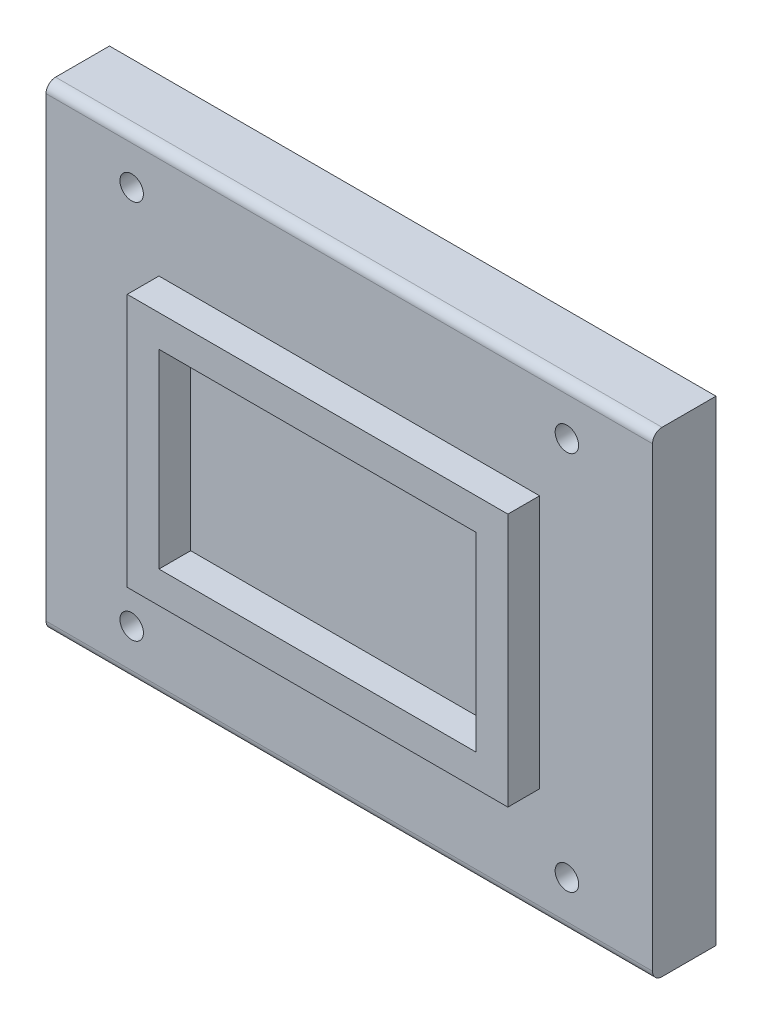
ISO-10303-21;
HEADER;
FILE_DESCRIPTION(('STEP AP214'),'2;1');
FILE_NAME('part.step','',(''),(''),'','','');
FILE_SCHEMA(('AUTOMOTIVE_DESIGN { 1 0 10303 214 1 1 1 1 }'));
ENDSEC;
DATA;
#1=APPLICATION_CONTEXT('core data for automotive mechanical design processes');
#2=APPLICATION_PROTOCOL_DEFINITION('international standard','automotive_design',2000,#1);
#3=PRODUCT_CONTEXT('',#1,'mechanical');
#4=PRODUCT('Part','Part','',(#3));
#5=PRODUCT_RELATED_PRODUCT_CATEGORY('part','',(#4));
#6=PRODUCT_DEFINITION_FORMATION('','',#4);
#7=PRODUCT_DEFINITION_CONTEXT('part definition',#1,'design');
#8=PRODUCT_DEFINITION('design','',#6,#7);
#9=PRODUCT_DEFINITION_SHAPE('','',#8);
#10=(LENGTH_UNIT() NAMED_UNIT(*) SI_UNIT(.MILLI.,.METRE.));
#11=(NAMED_UNIT(*) PLANE_ANGLE_UNIT() SI_UNIT($,.RADIAN.));
#12=(NAMED_UNIT(*) SI_UNIT($,.STERADIAN.) SOLID_ANGLE_UNIT());
#13=UNCERTAINTY_MEASURE_WITH_UNIT(LENGTH_MEASURE(1.E-05),#10,'distance_accuracy_value','');
#14=(GEOMETRIC_REPRESENTATION_CONTEXT(3) GLOBAL_UNCERTAINTY_ASSIGNED_CONTEXT((#13)) GLOBAL_UNIT_ASSIGNED_CONTEXT((#10,
#11,#12)) REPRESENTATION_CONTEXT('',''));
#15=CARTESIAN_POINT('',(0.,0.,0.));
#16=DIRECTION('',(0.,0.,1.));
#17=DIRECTION('',(1.,0.,0.));
#18=AXIS2_PLACEMENT_3D('',#15,#16,#17);
#19=CARTESIAN_POINT('',(0.,0.,10.));
#20=DIRECTION('',(0.,0.,1.));
#21=DIRECTION('',(1.,0.,0.));
#22=AXIS2_PLACEMENT_3D('',#19,#20,#21);
#23=PLANE('',#22);
#24=CARTESIAN_POINT('',(42.6478100784572,-49.8231019522776,10.));
#25=DIRECTION('',(0.,0.,1.));
#26=DIRECTION('',(1.,0.,0.));
#27=AXIS2_PLACEMENT_3D('',#24,#25,#26);
#28=CIRCLE('',#27,1.85);
#29=CARTESIAN_POINT('',(44.4978100784572,-49.8231019522776,10.));
#30=VERTEX_POINT('',#29);
#31=EDGE_CURVE('E232',#30,#30,#28,.T.);
#32=ORIENTED_EDGE('',*,*,#31,.F.);
#33=EDGE_LOOP('',(#32));
#34=FACE_BOUND('',#33,.T.);
#35=CARTESIAN_POINT('',(42.6478100784572,10.0768980477223,10.));
#36=DIRECTION('',(0.,0.,1.));
#37=DIRECTION('',(1.,0.,0.));
#38=AXIS2_PLACEMENT_3D('',#35,#36,#37);
#39=CIRCLE('',#38,1.85);
#40=CARTESIAN_POINT('',(44.4978100784572,10.0768980477223,10.));
#41=VERTEX_POINT('',#40);
#42=EDGE_CURVE('E248',#41,#41,#39,.T.);
#43=ORIENTED_EDGE('',*,*,#42,.F.);
#44=EDGE_LOOP('',(#43));
#45=FACE_BOUND('',#44,.T.);
#46=DIRECTION('',(0.,-1.,0.));
#47=VECTOR('',#46,1.);
#48=CARTESIAN_POINT('',(-39.4521899215428,17.6268980477223,10.));
#49=LINE('',#48,#47);
#50=CARTESIAN_POINT('',(-39.4521899215428,16.1268980477223,10.));
#51=VERTEX_POINT('',#50);
#52=CARTESIAN_POINT('',(-39.4521899215428,-55.8731019522776,10.));
#53=VERTEX_POINT('',#52);
#54=EDGE_CURVE('E264',#51,#53,#49,.T.);
#55=ORIENTED_EDGE('',*,*,#54,.T.);
#56=DIRECTION('',(1.,0.,0.));
#57=VECTOR('',#56,1.);
#58=CARTESIAN_POINT('',(56.1478100784572,-55.8731019522776,10.));
#59=LINE('',#58,#57);
#60=CARTESIAN_POINT('',(56.1478100784572,-55.8731019522776,10.));
#61=VERTEX_POINT('',#60);
#62=EDGE_CURVE('E303',#53,#61,#59,.T.);
#63=ORIENTED_EDGE('',*,*,#62,.T.);
#64=DIRECTION('',(0.,1.,0.));
#65=VECTOR('',#64,1.);
#66=CARTESIAN_POINT('',(56.1478100784572,17.6268980477223,10.));
#67=LINE('',#66,#65);
#68=CARTESIAN_POINT('',(56.1478100784572,16.1268980477223,10.));
#69=VERTEX_POINT('',#68);
#70=EDGE_CURVE('E268',#61,#69,#67,.T.);
#71=ORIENTED_EDGE('',*,*,#70,.T.);
#72=DIRECTION('',(-1.,0.,0.));
#73=VECTOR('',#72,1.);
#74=CARTESIAN_POINT('',(-39.4521899215428,16.1268980477223,10.));
#75=LINE('',#74,#73);
#76=EDGE_CURVE('E299',#69,#51,#75,.T.);
#77=ORIENTED_EDGE('',*,*,#76,.T.);
#78=EDGE_LOOP('',(#55,#63,#71,#77));
#79=FACE_BOUND('',#78,.T.);
#80=CARTESIAN_POINT('',(-25.9521899215428,10.0768980477223,10.));
#81=DIRECTION('',(0.,0.,1.));
#82=DIRECTION('',(1.,0.,0.));
#83=AXIS2_PLACEMENT_3D('',#80,#81,#82);
#84=CIRCLE('',#83,1.85);
#85=CARTESIAN_POINT('',(-24.1021899215428,10.0768980477223,10.));
#86=VERTEX_POINT('',#85);
#87=EDGE_CURVE('E256',#86,#86,#84,.T.);
#88=ORIENTED_EDGE('',*,*,#87,.F.);
#89=EDGE_LOOP('',(#88));
#90=FACE_BOUND('',#89,.T.);
#91=CARTESIAN_POINT('',(-25.9521899215428,-49.8231019522776,10.));
#92=DIRECTION('',(0.,0.,1.));
#93=DIRECTION('',(1.,0.,0.));
#94=AXIS2_PLACEMENT_3D('',#91,#92,#93);
#95=CIRCLE('',#94,1.85);
#96=CARTESIAN_POINT('',(-24.1021899215428,-49.8231019522776,10.));
#97=VERTEX_POINT('',#96);
#98=EDGE_CURVE('E240',#97,#97,#95,.T.);
#99=ORIENTED_EDGE('',*,*,#98,.F.);
#100=EDGE_LOOP('',(#99));
#101=FACE_BOUND('',#100,.T.);
#102=DIRECTION('',(1.,0.,0.));
#103=VECTOR('',#102,1.);
#104=CARTESIAN_POINT('',(-21.6521899215428,-39.8731019522776,10.));
#105=LINE('',#104,#103);
#106=CARTESIAN_POINT('',(-21.6521899215428,-39.8731019522776,10.));
#107=VERTEX_POINT('',#106);
#108=CARTESIAN_POINT('',(38.3478100784572,-39.8731019522776,10.));
#109=VERTEX_POINT('',#108);
#110=EDGE_CURVE('E211',#107,#109,#105,.T.);
#111=ORIENTED_EDGE('',*,*,#110,.F.);
#112=DIRECTION('',(0.,-1.,0.));
#113=VECTOR('',#112,1.);
#114=CARTESIAN_POINT('',(-21.6521899215428,0.126898047722354,10.));
#115=LINE('',#114,#113);
#116=CARTESIAN_POINT('',(-21.6521899215428,0.126898047722354,10.));
#117=VERTEX_POINT('',#116);
#118=EDGE_CURVE('E161',#117,#107,#115,.T.);
#119=ORIENTED_EDGE('',*,*,#118,.F.);
#120=DIRECTION('',(-1.,0.,0.));
#121=VECTOR('',#120,1.);
#122=CARTESIAN_POINT('',(-21.6521899215428,0.126898047722354,10.));
#123=LINE('',#122,#121);
#124=CARTESIAN_POINT('',(38.3478100784572,0.126898047722354,10.));
#125=VERTEX_POINT('',#124);
#126=EDGE_CURVE('E198',#125,#117,#123,.T.);
#127=ORIENTED_EDGE('',*,*,#126,.F.);
#128=DIRECTION('',(0.,1.,0.));
#129=VECTOR('',#128,1.);
#130=CARTESIAN_POINT('',(38.3478100784572,0.126898047722354,10.));
#131=LINE('',#130,#129);
#132=EDGE_CURVE('E214',#109,#125,#131,.T.);
#133=ORIENTED_EDGE('',*,*,#132,.F.);
#134=EDGE_LOOP('',(#111,#119,#127,#133));
#135=FACE_BOUND('',#134,.T.);
#136=ADVANCED_FACE('F39',(#34,#45,#79,#90,#101,#135),#23,.T.);
#137=CARTESIAN_POINT('',(0.,0.,0.));
#138=DIRECTION('',(0.,0.,1.));
#139=DIRECTION('',(1.,0.,0.));
#140=AXIS2_PLACEMENT_3D('',#137,#138,#139);
#141=PLANE('',#140);
#142=DIRECTION('',(0.,-1.,0.));
#143=VECTOR('',#142,1.);
#144=CARTESIAN_POINT('',(-39.4521899215428,17.6268980477223,0.));
#145=LINE('',#144,#143);
#146=CARTESIAN_POINT('',(-39.4521899215428,17.6268980477223,0.));
#147=VERTEX_POINT('',#146);
#148=CARTESIAN_POINT('',(-39.4521899215428,-57.3731019522777,0.));
#149=VERTEX_POINT('',#148);
#150=EDGE_CURVE('E260',#147,#149,#145,.T.);
#151=ORIENTED_EDGE('',*,*,#150,.F.);
#152=DIRECTION('',(-1.,0.,0.));
#153=VECTOR('',#152,1.);
#154=CARTESIAN_POINT('',(-39.4521899215428,17.6268980477223,0.));
#155=LINE('',#154,#153);
#156=CARTESIAN_POINT('',(56.1478100784572,17.6268980477223,0.));
#157=VERTEX_POINT('',#156);
#158=EDGE_CURVE('E269',#157,#147,#155,.T.);
#159=ORIENTED_EDGE('',*,*,#158,.F.);
#160=DIRECTION('',(0.,1.,0.));
#161=VECTOR('',#160,1.);
#162=CARTESIAN_POINT('',(56.1478100784572,17.6268980477223,0.));
#163=LINE('',#162,#161);
#164=CARTESIAN_POINT('',(56.1478100784572,-57.3731019522777,0.));
#165=VERTEX_POINT('',#164);
#166=EDGE_CURVE('E281',#165,#157,#163,.T.);
#167=ORIENTED_EDGE('',*,*,#166,.F.);
#168=DIRECTION('',(1.,0.,0.));
#169=VECTOR('',#168,1.);
#170=CARTESIAN_POINT('',(-39.4521899215428,-57.3731019522777,0.));
#171=LINE('',#170,#169);
#172=EDGE_CURVE('E277',#149,#165,#171,.T.);
#173=ORIENTED_EDGE('',*,*,#172,.F.);
#174=EDGE_LOOP('',(#151,#159,#167,#173));
#175=FACE_BOUND('',#174,.T.);
#176=CARTESIAN_POINT('',(-25.9521899215428,10.0768980477223,0.));
#177=DIRECTION('',(0.,0.,1.));
#178=DIRECTION('',(1.,0.,0.));
#179=AXIS2_PLACEMENT_3D('',#176,#177,#178);
#180=CIRCLE('',#179,1.85);
#181=CARTESIAN_POINT('',(-24.1021899215428,10.0768980477223,0.));
#182=VERTEX_POINT('',#181);
#183=EDGE_CURVE('E252',#182,#182,#180,.T.);
#184=ORIENTED_EDGE('',*,*,#183,.T.);
#185=EDGE_LOOP('',(#184));
#186=FACE_BOUND('',#185,.T.);
#187=CARTESIAN_POINT('',(42.6478100784572,10.0768980477223,0.));
#188=DIRECTION('',(0.,0.,1.));
#189=DIRECTION('',(1.,0.,0.));
#190=AXIS2_PLACEMENT_3D('',#187,#188,#189);
#191=CIRCLE('',#190,1.85);
#192=CARTESIAN_POINT('',(44.4978100784572,10.0768980477223,0.));
#193=VERTEX_POINT('',#192);
#194=EDGE_CURVE('E244',#193,#193,#191,.T.);
#195=ORIENTED_EDGE('',*,*,#194,.T.);
#196=EDGE_LOOP('',(#195));
#197=FACE_BOUND('',#196,.T.);
#198=CARTESIAN_POINT('',(-25.9521899215428,-49.8231019522776,0.));
#199=DIRECTION('',(0.,0.,1.));
#200=DIRECTION('',(1.,0.,0.));
#201=AXIS2_PLACEMENT_3D('',#198,#199,#200);
#202=CIRCLE('',#201,1.85);
#203=CARTESIAN_POINT('',(-24.1021899215428,-49.8231019522776,0.));
#204=VERTEX_POINT('',#203);
#205=EDGE_CURVE('E236',#204,#204,#202,.T.);
#206=ORIENTED_EDGE('',*,*,#205,.T.);
#207=EDGE_LOOP('',(#206));
#208=FACE_BOUND('',#207,.T.);
#209=CARTESIAN_POINT('',(42.6478100784572,-49.8231019522776,0.));
#210=DIRECTION('',(0.,0.,1.));
#211=DIRECTION('',(1.,0.,0.));
#212=AXIS2_PLACEMENT_3D('',#209,#210,#211);
#213=CIRCLE('',#212,1.85);
#214=CARTESIAN_POINT('',(44.4978100784572,-49.8231019522776,0.));
#215=VERTEX_POINT('',#214);
#216=EDGE_CURVE('E231',#215,#215,#213,.T.);
#217=ORIENTED_EDGE('',*,*,#216,.T.);
#218=EDGE_LOOP('',(#217));
#219=FACE_BOUND('',#218,.T.);
#220=ADVANCED_FACE('F342',(#175,#186,#197,#208,#219),#141,.F.);
#221=CARTESIAN_POINT('',(-39.4521899215428,17.6268980477223,10.));
#222=DIRECTION('',(1.,0.,0.));
#223=DIRECTION('',(0.,1.,0.));
#224=AXIS2_PLACEMENT_3D('',#221,#222,#223);
#225=PLANE('',#224);
#226=DIRECTION('',(0.,0.,-1.));
#227=VECTOR('',#226,1.);
#228=CARTESIAN_POINT('',(-39.4521899215428,-57.3731019522777,10.));
#229=LINE('',#228,#227);
#230=CARTESIAN_POINT('',(-39.4521899215428,-57.3731019522777,8.5));
#231=VERTEX_POINT('',#230);
#232=EDGE_CURVE('E296',#231,#149,#229,.T.);
#233=ORIENTED_EDGE('',*,*,#232,.F.);
#234=CARTESIAN_POINT('',(-39.4521899215428,-55.8731019522776,8.5));
#235=DIRECTION('',(1.,0.,0.));
#236=DIRECTION('',(0.,1.,0.));
#237=AXIS2_PLACEMENT_3D('',#234,#235,#236);
#238=CIRCLE('',#237,1.5);
#239=EDGE_CURVE('E48',#231,#53,#238,.F.);
#240=ORIENTED_EDGE('',*,*,#239,.T.);
#241=ORIENTED_EDGE('',*,*,#54,.F.);
#242=CARTESIAN_POINT('',(-39.4521899215428,16.1268980477223,8.5));
#243=DIRECTION('',(1.,0.,0.));
#244=DIRECTION('',(0.,1.,0.));
#245=AXIS2_PLACEMENT_3D('',#242,#243,#244);
#246=CIRCLE('',#245,1.5);
#247=CARTESIAN_POINT('',(-39.4521899215428,17.6268980477223,8.5));
#248=VERTEX_POINT('',#247);
#249=EDGE_CURVE('E316',#51,#248,#246,.F.);
#250=ORIENTED_EDGE('',*,*,#249,.T.);
#251=DIRECTION('',(0.,0.,-1.));
#252=VECTOR('',#251,1.);
#253=CARTESIAN_POINT('',(-39.4521899215428,17.6268980477223,10.));
#254=LINE('',#253,#252);
#255=EDGE_CURVE('E273',#248,#147,#254,.T.);
#256=ORIENTED_EDGE('',*,*,#255,.T.);
#257=ORIENTED_EDGE('',*,*,#150,.T.);
#258=EDGE_LOOP('',(#233,#240,#241,#250,#256,#257));
#259=FACE_BOUND('',#258,.T.);
#260=ADVANCED_FACE('F323',(#259),#225,.F.);
#261=CARTESIAN_POINT('',(-39.4521899215428,-57.3731019522777,10.));
#262=DIRECTION('',(0.,1.,0.));
#263=DIRECTION('',(0.,0.,1.));
#264=AXIS2_PLACEMENT_3D('',#261,#262,#263);
#265=PLANE('',#264);
#266=DIRECTION('',(0.,0.,-1.));
#267=VECTOR('',#266,1.);
#268=CARTESIAN_POINT('',(56.1478100784572,-57.3731019522777,10.));
#269=LINE('',#268,#267);
#270=CARTESIAN_POINT('',(56.1478100784572,-57.3731019522777,8.5));
#271=VERTEX_POINT('',#270);
#272=EDGE_CURVE('E293',#271,#165,#269,.T.);
#273=ORIENTED_EDGE('',*,*,#272,.F.);
#274=DIRECTION('',(1.,0.,0.));
#275=VECTOR('',#274,1.);
#276=CARTESIAN_POINT('',(-39.4521899215428,-57.3731019522777,8.5));
#277=LINE('',#276,#275);
#278=EDGE_CURVE('E313',#271,#231,#277,.F.);
#279=ORIENTED_EDGE('',*,*,#278,.T.);
#280=ORIENTED_EDGE('',*,*,#232,.T.);
#281=ORIENTED_EDGE('',*,*,#172,.T.);
#282=EDGE_LOOP('',(#273,#279,#280,#281));
#283=FACE_BOUND('',#282,.T.);
#284=ADVANCED_FACE('F336',(#283),#265,.F.);
#285=CARTESIAN_POINT('',(56.1478100784572,17.6268980477223,10.));
#286=DIRECTION('',(-1.,0.,0.));
#287=DIRECTION('',(0.,-1.,0.));
#288=AXIS2_PLACEMENT_3D('',#285,#286,#287);
#289=PLANE('',#288);
#290=ORIENTED_EDGE('',*,*,#70,.F.);
#291=CARTESIAN_POINT('',(56.1478100784572,-55.8731019522776,8.5));
#292=DIRECTION('',(-1.,0.,0.));
#293=DIRECTION('',(0.,-1.,0.));
#294=AXIS2_PLACEMENT_3D('',#291,#292,#293);
#295=CIRCLE('',#294,1.5);
#296=EDGE_CURVE('E310',#61,#271,#295,.F.);
#297=ORIENTED_EDGE('',*,*,#296,.T.);
#298=ORIENTED_EDGE('',*,*,#272,.T.);
#299=ORIENTED_EDGE('',*,*,#166,.T.);
#300=DIRECTION('',(0.,0.,-1.));
#301=VECTOR('',#300,1.);
#302=CARTESIAN_POINT('',(56.1478100784572,17.6268980477223,10.));
#303=LINE('',#302,#301);
#304=CARTESIAN_POINT('',(56.1478100784572,17.6268980477223,8.5));
#305=VERTEX_POINT('',#304);
#306=EDGE_CURVE('E290',#305,#157,#303,.T.);
#307=ORIENTED_EDGE('',*,*,#306,.F.);
#308=CARTESIAN_POINT('',(56.1478100784572,16.1268980477223,8.5));
#309=DIRECTION('',(-1.,0.,0.));
#310=DIRECTION('',(0.,-1.,0.));
#311=AXIS2_PLACEMENT_3D('',#308,#309,#310);
#312=CIRCLE('',#311,1.5);
#313=EDGE_CURVE('E307',#305,#69,#312,.F.);
#314=ORIENTED_EDGE('',*,*,#313,.T.);
#315=EDGE_LOOP('',(#290,#297,#298,#299,#307,#314));
#316=FACE_BOUND('',#315,.T.);
#317=ADVANCED_FACE('F334',(#316),#289,.F.);
#318=CARTESIAN_POINT('',(-39.4521899215428,17.6268980477223,10.));
#319=DIRECTION('',(0.,-1.,0.));
#320=DIRECTION('',(0.,0.,-1.));
#321=AXIS2_PLACEMENT_3D('',#318,#319,#320);
#322=PLANE('',#321);
#323=ORIENTED_EDGE('',*,*,#255,.F.);
#324=DIRECTION('',(-1.,0.,0.));
#325=VECTOR('',#324,1.);
#326=CARTESIAN_POINT('',(56.1478100784572,17.6268980477223,8.5));
#327=LINE('',#326,#325);
#328=EDGE_CURVE('E11',#248,#305,#327,.F.);
#329=ORIENTED_EDGE('',*,*,#328,.T.);
#330=ORIENTED_EDGE('',*,*,#306,.T.);
#331=ORIENTED_EDGE('',*,*,#158,.T.);
#332=EDGE_LOOP('',(#323,#329,#330,#331));
#333=FACE_BOUND('',#332,.T.);
#334=ADVANCED_FACE('F350',(#333),#322,.F.);
#335=CARTESIAN_POINT('',(-25.9521899215428,10.0768980477223,10.));
#336=DIRECTION('',(0.,0.,-1.));
#337=DIRECTION('',(-1.,0.,0.));
#338=AXIS2_PLACEMENT_3D('',#335,#336,#337);
#339=CYLINDRICAL_SURFACE('',#338,1.85);
#340=ORIENTED_EDGE('',*,*,#87,.T.);
#341=EDGE_LOOP('',(#340));
#342=FACE_BOUND('',#341,.T.);
#343=ORIENTED_EDGE('',*,*,#183,.F.);
#344=EDGE_LOOP('',(#343));
#345=FACE_BOUND('',#344,.T.);
#346=ADVANCED_FACE('F352',(#342,#345),#339,.F.);
#347=CARTESIAN_POINT('',(42.6478100784572,10.0768980477223,10.));
#348=DIRECTION('',(0.,0.,-1.));
#349=DIRECTION('',(-1.,0.,0.));
#350=AXIS2_PLACEMENT_3D('',#347,#348,#349);
#351=CYLINDRICAL_SURFACE('',#350,1.85);
#352=ORIENTED_EDGE('',*,*,#42,.T.);
#353=EDGE_LOOP('',(#352));
#354=FACE_BOUND('',#353,.T.);
#355=ORIENTED_EDGE('',*,*,#194,.F.);
#356=EDGE_LOOP('',(#355));
#357=FACE_BOUND('',#356,.T.);
#358=ADVANCED_FACE('F358',(#354,#357),#351,.F.);
#359=CARTESIAN_POINT('',(-25.9521899215428,-49.8231019522776,10.));
#360=DIRECTION('',(0.,0.,-1.));
#361=DIRECTION('',(-1.,0.,0.));
#362=AXIS2_PLACEMENT_3D('',#359,#360,#361);
#363=CYLINDRICAL_SURFACE('',#362,1.85);
#364=ORIENTED_EDGE('',*,*,#98,.T.);
#365=EDGE_LOOP('',(#364));
#366=FACE_BOUND('',#365,.T.);
#367=ORIENTED_EDGE('',*,*,#205,.F.);
#368=EDGE_LOOP('',(#367));
#369=FACE_BOUND('',#368,.T.);
#370=ADVANCED_FACE('F412',(#366,#369),#363,.F.);
#371=CARTESIAN_POINT('',(42.6478100784572,-49.8231019522776,10.));
#372=DIRECTION('',(0.,0.,-1.));
#373=DIRECTION('',(-1.,0.,0.));
#374=AXIS2_PLACEMENT_3D('',#371,#372,#373);
#375=CYLINDRICAL_SURFACE('',#374,1.85);
#376=ORIENTED_EDGE('',*,*,#31,.T.);
#377=EDGE_LOOP('',(#376));
#378=FACE_BOUND('',#377,.T.);
#379=ORIENTED_EDGE('',*,*,#216,.F.);
#380=EDGE_LOOP('',(#379));
#381=FACE_BOUND('',#380,.T.);
#382=ADVANCED_FACE('F409',(#378,#381),#375,.F.);
#383=CARTESIAN_POINT('',(0.,-55.8731019522776,8.5));
#384=DIRECTION('',(-1.,0.,0.));
#385=DIRECTION('',(0.,0.,1.));
#386=AXIS2_PLACEMENT_3D('',#383,#384,#385);
#387=CYLINDRICAL_SURFACE('',#386,1.5);
#388=ORIENTED_EDGE('',*,*,#239,.F.);
#389=ORIENTED_EDGE('',*,*,#278,.F.);
#390=ORIENTED_EDGE('',*,*,#296,.F.);
#391=ORIENTED_EDGE('',*,*,#62,.F.);
#392=EDGE_LOOP('',(#388,#389,#390,#391));
#393=FACE_BOUND('',#392,.T.);
#394=ADVANCED_FACE('F331',(#393),#387,.T.);
#395=CARTESIAN_POINT('',(0.,16.1268980477223,8.5));
#396=DIRECTION('',(1.,0.,0.));
#397=DIRECTION('',(0.,0.,-1.));
#398=AXIS2_PLACEMENT_3D('',#395,#396,#397);
#399=CYLINDRICAL_SURFACE('',#398,1.5);
#400=ORIENTED_EDGE('',*,*,#313,.F.);
#401=ORIENTED_EDGE('',*,*,#328,.F.);
#402=ORIENTED_EDGE('',*,*,#249,.F.);
#403=ORIENTED_EDGE('',*,*,#76,.F.);
#404=EDGE_LOOP('',(#400,#401,#402,#403));
#405=FACE_BOUND('',#404,.T.);
#406=ADVANCED_FACE('F41',(#405),#399,.T.);
#407=CARTESIAN_POINT('',(0.,0.,15.));
#408=DIRECTION('',(0.,0.,1.));
#409=DIRECTION('',(1.,0.,0.));
#410=AXIS2_PLACEMENT_3D('',#407,#408,#409);
#411=PLANE('',#410);
#412=DIRECTION('',(0.,-1.,0.));
#413=VECTOR('',#412,1.);
#414=CARTESIAN_POINT('',(-21.6521899215428,0.126898047722354,15.));
#415=LINE('',#414,#413);
#416=CARTESIAN_POINT('',(-21.6521899215428,0.126898047722354,15.));
#417=VERTEX_POINT('',#416);
#418=CARTESIAN_POINT('',(-21.6521899215428,-39.8731019522776,15.));
#419=VERTEX_POINT('',#418);
#420=EDGE_CURVE('E193',#417,#419,#415,.T.);
#421=ORIENTED_EDGE('',*,*,#420,.T.);
#422=DIRECTION('',(1.,0.,0.));
#423=VECTOR('',#422,1.);
#424=CARTESIAN_POINT('',(-21.6521899215428,-39.8731019522776,15.));
#425=LINE('',#424,#423);
#426=CARTESIAN_POINT('',(38.3478100784572,-39.8731019522776,15.));
#427=VERTEX_POINT('',#426);
#428=EDGE_CURVE('E197',#419,#427,#425,.T.);
#429=ORIENTED_EDGE('',*,*,#428,.T.);
#430=DIRECTION('',(0.,1.,0.));
#431=VECTOR('',#430,1.);
#432=CARTESIAN_POINT('',(38.3478100784572,0.126898047722354,15.));
#433=LINE('',#432,#431);
#434=CARTESIAN_POINT('',(38.3478100784572,0.126898047722354,15.));
#435=VERTEX_POINT('',#434);
#436=EDGE_CURVE('E201',#427,#435,#433,.T.);
#437=ORIENTED_EDGE('',*,*,#436,.T.);
#438=DIRECTION('',(-1.,0.,0.));
#439=VECTOR('',#438,1.);
#440=CARTESIAN_POINT('',(-21.6521899215428,0.126898047722354,15.));
#441=LINE('',#440,#439);
#442=EDGE_CURVE('E204',#435,#417,#441,.T.);
#443=ORIENTED_EDGE('',*,*,#442,.T.);
#444=EDGE_LOOP('',(#421,#429,#437,#443));
#445=FACE_BOUND('',#444,.T.);
#446=DIRECTION('',(1.,0.,0.));
#447=VECTOR('',#446,1.);
#448=CARTESIAN_POINT('',(-16.6521899215428,-34.8731019522777,15.));
#449=LINE('',#448,#447);
#450=CARTESIAN_POINT('',(-16.6521899215428,-34.8731019522777,15.));
#451=VERTEX_POINT('',#450);
#452=CARTESIAN_POINT('',(33.3478100784572,-34.8731019522777,15.));
#453=VERTEX_POINT('',#452);
#454=EDGE_CURVE('E152',#451,#453,#449,.T.);
#455=ORIENTED_EDGE('',*,*,#454,.F.);
#456=DIRECTION('',(0.,-1.,0.));
#457=VECTOR('',#456,1.);
#458=CARTESIAN_POINT('',(-16.6521899215428,-4.87310195227765,15.));
#459=LINE('',#458,#457);
#460=CARTESIAN_POINT('',(-16.6521899215428,-4.87310195227765,15.));
#461=VERTEX_POINT('',#460);
#462=EDGE_CURVE('E142',#461,#451,#459,.T.);
#463=ORIENTED_EDGE('',*,*,#462,.F.);
#464=DIRECTION('',(-1.,0.,0.));
#465=VECTOR('',#464,1.);
#466=CARTESIAN_POINT('',(-16.6521899215428,-4.87310195227765,15.));
#467=LINE('',#466,#465);
#468=CARTESIAN_POINT('',(33.3478100784572,-4.87310195227765,15.));
#469=VERTEX_POINT('',#468);
#470=EDGE_CURVE('E171',#469,#461,#467,.T.);
#471=ORIENTED_EDGE('',*,*,#470,.F.);
#472=DIRECTION('',(0.,1.,0.));
#473=VECTOR('',#472,1.);
#474=CARTESIAN_POINT('',(33.3478100784572,-4.87310195227765,15.));
#475=LINE('',#474,#473);
#476=EDGE_CURVE('E167',#453,#469,#475,.T.);
#477=ORIENTED_EDGE('',*,*,#476,.F.);
#478=EDGE_LOOP('',(#455,#463,#471,#477));
#479=FACE_BOUND('',#478,.T.);
#480=ADVANCED_FACE('F165',(#445,#479),#411,.T.);
#481=CARTESIAN_POINT('',(-21.6521899215428,0.126898047722354,15.));
#482=DIRECTION('',(1.,0.,0.));
#483=DIRECTION('',(0.,1.,0.));
#484=AXIS2_PLACEMENT_3D('',#481,#482,#483);
#485=PLANE('',#484);
#486=ORIENTED_EDGE('',*,*,#118,.T.);
#487=DIRECTION('',(0.,0.,-1.));
#488=VECTOR('',#487,1.);
#489=CARTESIAN_POINT('',(-21.6521899215428,-39.8731019522776,15.));
#490=LINE('',#489,#488);
#491=EDGE_CURVE('E228',#419,#107,#490,.T.);
#492=ORIENTED_EDGE('',*,*,#491,.F.);
#493=ORIENTED_EDGE('',*,*,#420,.F.);
#494=DIRECTION('',(0.,0.,-1.));
#495=VECTOR('',#494,1.);
#496=CARTESIAN_POINT('',(-21.6521899215428,0.126898047722354,15.));
#497=LINE('',#496,#495);
#498=EDGE_CURVE('E207',#417,#117,#497,.T.);
#499=ORIENTED_EDGE('',*,*,#498,.T.);
#500=EDGE_LOOP('',(#486,#492,#493,#499));
#501=FACE_BOUND('',#500,.T.);
#502=ADVANCED_FACE('F394',(#501),#485,.F.);
#503=CARTESIAN_POINT('',(-21.6521899215428,-39.8731019522776,15.));
#504=DIRECTION('',(0.,1.,0.));
#505=DIRECTION('',(0.,0.,1.));
#506=AXIS2_PLACEMENT_3D('',#503,#504,#505);
#507=PLANE('',#506);
#508=ORIENTED_EDGE('',*,*,#110,.T.);
#509=DIRECTION('',(0.,0.,-1.));
#510=VECTOR('',#509,1.);
#511=CARTESIAN_POINT('',(38.3478100784572,-39.8731019522776,15.));
#512=LINE('',#511,#510);
#513=EDGE_CURVE('E224',#427,#109,#512,.T.);
#514=ORIENTED_EDGE('',*,*,#513,.F.);
#515=ORIENTED_EDGE('',*,*,#428,.F.);
#516=ORIENTED_EDGE('',*,*,#491,.T.);
#517=EDGE_LOOP('',(#508,#514,#515,#516));
#518=FACE_BOUND('',#517,.T.);
#519=ADVANCED_FACE('F401',(#518),#507,.F.);
#520=CARTESIAN_POINT('',(38.3478100784572,0.126898047722354,15.));
#521=DIRECTION('',(-1.,0.,0.));
#522=DIRECTION('',(0.,-1.,0.));
#523=AXIS2_PLACEMENT_3D('',#520,#521,#522);
#524=PLANE('',#523);
#525=ORIENTED_EDGE('',*,*,#132,.T.);
#526=DIRECTION('',(0.,0.,-1.));
#527=VECTOR('',#526,1.);
#528=CARTESIAN_POINT('',(38.3478100784572,0.126898047722354,15.));
#529=LINE('',#528,#527);
#530=EDGE_CURVE('E55',#435,#125,#529,.T.);
#531=ORIENTED_EDGE('',*,*,#530,.F.);
#532=ORIENTED_EDGE('',*,*,#436,.F.);
#533=ORIENTED_EDGE('',*,*,#513,.T.);
#534=EDGE_LOOP('',(#525,#531,#532,#533));
#535=FACE_BOUND('',#534,.T.);
#536=ADVANCED_FACE('F398',(#535),#524,.F.);
#537=CARTESIAN_POINT('',(-21.6521899215428,0.126898047722354,15.));
#538=DIRECTION('',(0.,-1.,0.));
#539=DIRECTION('',(0.,0.,-1.));
#540=AXIS2_PLACEMENT_3D('',#537,#538,#539);
#541=PLANE('',#540);
#542=ORIENTED_EDGE('',*,*,#126,.T.);
#543=ORIENTED_EDGE('',*,*,#498,.F.);
#544=ORIENTED_EDGE('',*,*,#442,.F.);
#545=ORIENTED_EDGE('',*,*,#530,.T.);
#546=EDGE_LOOP('',(#542,#543,#544,#545));
#547=FACE_BOUND('',#546,.T.);
#548=ADVANCED_FACE('F391',(#547),#541,.F.);
#549=CARTESIAN_POINT('',(-16.6521899215428,-4.87310195227765,15.));
#550=DIRECTION('',(1.,0.,0.));
#551=DIRECTION('',(0.,1.,0.));
#552=AXIS2_PLACEMENT_3D('',#549,#550,#551);
#553=PLANE('',#552);
#554=DIRECTION('',(0.,-1.,0.));
#555=VECTOR('',#554,1.);
#556=CARTESIAN_POINT('',(-16.6521899215428,-4.87310195227765,10.));
#557=LINE('',#556,#555);
#558=CARTESIAN_POINT('',(-16.6521899215428,-4.87310195227765,10.));
#559=VERTEX_POINT('',#558);
#560=CARTESIAN_POINT('',(-16.6521899215428,-34.8731019522777,10.));
#561=VERTEX_POINT('',#560);
#562=EDGE_CURVE('E63',#559,#561,#557,.T.);
#563=ORIENTED_EDGE('',*,*,#562,.F.);
#564=DIRECTION('',(0.,0.,-1.));
#565=VECTOR('',#564,1.);
#566=CARTESIAN_POINT('',(-16.6521899215428,-4.87310195227765,15.));
#567=LINE('',#566,#565);
#568=EDGE_CURVE('E147',#461,#559,#567,.T.);
#569=ORIENTED_EDGE('',*,*,#568,.F.);
#570=ORIENTED_EDGE('',*,*,#462,.T.);
#571=DIRECTION('',(0.,0.,-1.));
#572=VECTOR('',#571,1.);
#573=CARTESIAN_POINT('',(-16.6521899215428,-34.8731019522777,15.));
#574=LINE('',#573,#572);
#575=EDGE_CURVE('E145',#451,#561,#574,.T.);
#576=ORIENTED_EDGE('',*,*,#575,.T.);
#577=EDGE_LOOP('',(#563,#569,#570,#576));
#578=FACE_BOUND('',#577,.T.);
#579=ADVANCED_FACE('F144',(#578),#553,.T.);
#580=CARTESIAN_POINT('',(-16.6521899215428,-34.8731019522777,15.));
#581=DIRECTION('',(0.,1.,0.));
#582=DIRECTION('',(0.,0.,1.));
#583=AXIS2_PLACEMENT_3D('',#580,#581,#582);
#584=PLANE('',#583);
#585=DIRECTION('',(1.,0.,0.));
#586=VECTOR('',#585,1.);
#587=CARTESIAN_POINT('',(-16.6521899215428,-34.8731019522777,10.));
#588=LINE('',#587,#586);
#589=CARTESIAN_POINT('',(33.3478100784572,-34.8731019522777,10.));
#590=VERTEX_POINT('',#589);
#591=EDGE_CURVE('E159',#561,#590,#588,.T.);
#592=ORIENTED_EDGE('',*,*,#591,.F.);
#593=ORIENTED_EDGE('',*,*,#575,.F.);
#594=ORIENTED_EDGE('',*,*,#454,.T.);
#595=DIRECTION('',(0.,0.,-1.));
#596=VECTOR('',#595,1.);
#597=CARTESIAN_POINT('',(33.3478100784572,-34.8731019522777,15.));
#598=LINE('',#597,#596);
#599=EDGE_CURVE('E162',#453,#590,#598,.T.);
#600=ORIENTED_EDGE('',*,*,#599,.T.);
#601=EDGE_LOOP('',(#592,#593,#594,#600));
#602=FACE_BOUND('',#601,.T.);
#603=ADVANCED_FACE('F156',(#602),#584,.T.);
#604=CARTESIAN_POINT('',(33.3478100784572,-4.87310195227765,15.));
#605=DIRECTION('',(-1.,0.,0.));
#606=DIRECTION('',(0.,-1.,0.));
#607=AXIS2_PLACEMENT_3D('',#604,#605,#606);
#608=PLANE('',#607);
#609=DIRECTION('',(0.,1.,0.));
#610=VECTOR('',#609,1.);
#611=CARTESIAN_POINT('',(33.3478100784572,-4.87310195227765,10.));
#612=LINE('',#611,#610);
#613=CARTESIAN_POINT('',(33.3478100784572,-4.87310195227765,10.));
#614=VERTEX_POINT('',#613);
#615=EDGE_CURVE('E180',#590,#614,#612,.T.);
#616=ORIENTED_EDGE('',*,*,#615,.F.);
#617=ORIENTED_EDGE('',*,*,#599,.F.);
#618=ORIENTED_EDGE('',*,*,#476,.T.);
#619=DIRECTION('',(0.,0.,-1.));
#620=VECTOR('',#619,1.);
#621=CARTESIAN_POINT('',(33.3478100784572,-4.87310195227765,15.));
#622=LINE('',#621,#620);
#623=EDGE_CURVE('E187',#469,#614,#622,.T.);
#624=ORIENTED_EDGE('',*,*,#623,.T.);
#625=EDGE_LOOP('',(#616,#617,#618,#624));
#626=FACE_BOUND('',#625,.T.);
#627=ADVANCED_FACE('F377',(#626),#608,.T.);
#628=CARTESIAN_POINT('',(-16.6521899215428,-4.87310195227765,15.));
#629=DIRECTION('',(0.,-1.,0.));
#630=DIRECTION('',(0.,0.,-1.));
#631=AXIS2_PLACEMENT_3D('',#628,#629,#630);
#632=PLANE('',#631);
#633=DIRECTION('',(-1.,0.,0.));
#634=VECTOR('',#633,1.);
#635=CARTESIAN_POINT('',(-16.6521899215428,-4.87310195227765,10.));
#636=LINE('',#635,#634);
#637=EDGE_CURVE('E153',#614,#559,#636,.T.);
#638=ORIENTED_EDGE('',*,*,#637,.F.);
#639=ORIENTED_EDGE('',*,*,#623,.F.);
#640=ORIENTED_EDGE('',*,*,#470,.T.);
#641=ORIENTED_EDGE('',*,*,#568,.T.);
#642=EDGE_LOOP('',(#638,#639,#640,#641));
#643=FACE_BOUND('',#642,.T.);
#644=ADVANCED_FACE('F373',(#643),#632,.T.);
#645=ORIENTED_EDGE('',*,*,#562,.T.);
#646=ORIENTED_EDGE('',*,*,#591,.T.);
#647=ORIENTED_EDGE('',*,*,#615,.T.);
#648=ORIENTED_EDGE('',*,*,#637,.T.);
#649=EDGE_LOOP('',(#645,#646,#647,#648));
#650=FACE_BOUND('',#649,.T.);
#651=ADVANCED_FACE('F366',(#650),#23,.T.);
#652=CLOSED_SHELL('',(#136,#220,#260,#284,#317,#334,#346,#358,#370,#382,#394,#406,#480,#502,
#519,#536,#548,#579,#603,#627,#644,#651));
#653=MANIFOLD_SOLID_BREP('B2',#652);
#654=ADVANCED_BREP_SHAPE_REPRESENTATION('',(#18,#653),#14);
#655=SHAPE_DEFINITION_REPRESENTATION(#9,#654);
ENDSEC;
END-ISO-10303-21;
